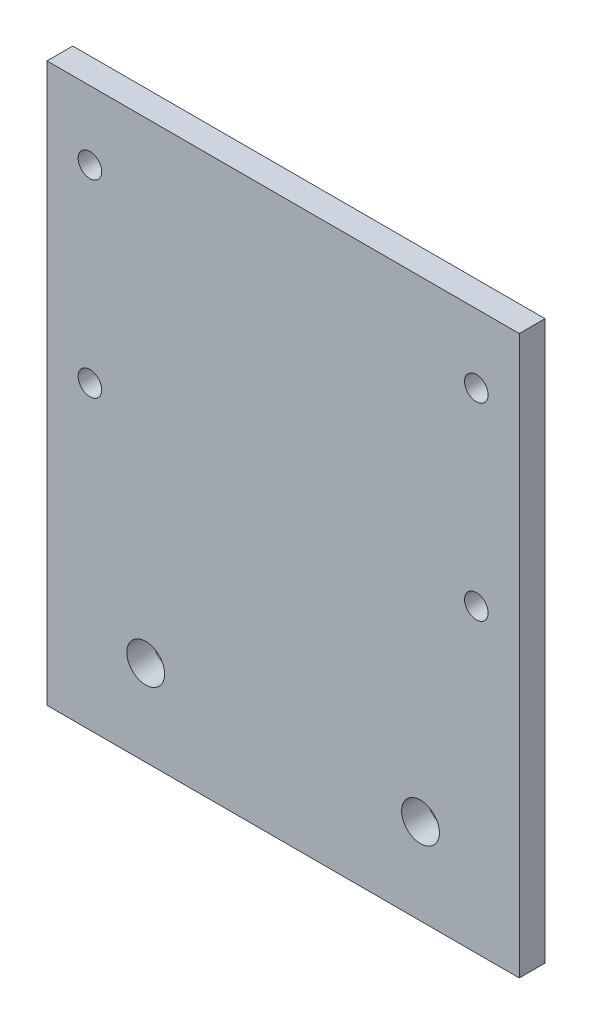
ISO-10303-21;
HEADER;
FILE_DESCRIPTION(('STEP AP214'),'2;1');
FILE_NAME('part.step','',(''),(''),'','','');
FILE_SCHEMA(('AUTOMOTIVE_DESIGN { 1 0 10303 214 1 1 1 1 }'));
ENDSEC;
DATA;
#1=APPLICATION_CONTEXT('core data for automotive mechanical design processes');
#2=APPLICATION_PROTOCOL_DEFINITION('international standard','automotive_design',2000,#1);
#3=PRODUCT_CONTEXT('',#1,'mechanical');
#4=PRODUCT('Part','Part','',(#3));
#5=PRODUCT_RELATED_PRODUCT_CATEGORY('part','',(#4));
#6=PRODUCT_DEFINITION_FORMATION('','',#4);
#7=PRODUCT_DEFINITION_CONTEXT('part definition',#1,'design');
#8=PRODUCT_DEFINITION('design','',#6,#7);
#9=PRODUCT_DEFINITION_SHAPE('','',#8);
#10=(LENGTH_UNIT() NAMED_UNIT(*) SI_UNIT(.MILLI.,.METRE.));
#11=(NAMED_UNIT(*) PLANE_ANGLE_UNIT() SI_UNIT($,.RADIAN.));
#12=(NAMED_UNIT(*) SI_UNIT($,.STERADIAN.) SOLID_ANGLE_UNIT());
#13=UNCERTAINTY_MEASURE_WITH_UNIT(LENGTH_MEASURE(1.E-05),#10,'distance_accuracy_value','');
#14=(GEOMETRIC_REPRESENTATION_CONTEXT(3) GLOBAL_UNCERTAINTY_ASSIGNED_CONTEXT((#13)) GLOBAL_UNIT_ASSIGNED_CONTEXT((#10,
#11,#12)) REPRESENTATION_CONTEXT('',''));
#15=CARTESIAN_POINT('',(0.,0.,0.));
#16=DIRECTION('',(0.,0.,1.));
#17=DIRECTION('',(1.,0.,0.));
#18=AXIS2_PLACEMENT_3D('',#15,#16,#17);
#19=CARTESIAN_POINT('',(0.,0.,3.));
#20=DIRECTION('',(0.,0.,-1.));
#21=DIRECTION('',(-1.,0.,0.));
#22=AXIS2_PLACEMENT_3D('',#19,#20,#21);
#23=PLANE('',#22);
#24=DIRECTION('',(0.,-1.,0.));
#25=VECTOR('',#24,1.);
#26=CARTESIAN_POINT('',(0.,0.,3.));
#27=LINE('',#26,#25);
#28=CARTESIAN_POINT('',(0.,65.,3.));
#29=VERTEX_POINT('',#28);
#30=CARTESIAN_POINT('',(0.,0.,3.));
#31=VERTEX_POINT('',#30);
#32=EDGE_CURVE('E92',#29,#31,#27,.T.);
#33=ORIENTED_EDGE('',*,*,#32,.T.);
#34=DIRECTION('',(1.,0.,0.));
#35=VECTOR('',#34,1.);
#36=CARTESIAN_POINT('',(0.,0.,3.));
#37=LINE('',#36,#35);
#38=CARTESIAN_POINT('',(55.,0.,3.));
#39=VERTEX_POINT('',#38);
#40=EDGE_CURVE('E87',#31,#39,#37,.T.);
#41=ORIENTED_EDGE('',*,*,#40,.T.);
#42=DIRECTION('',(0.,1.,0.));
#43=VECTOR('',#42,1.);
#44=CARTESIAN_POINT('',(55.,0.,3.));
#45=LINE('',#44,#43);
#46=CARTESIAN_POINT('',(55.,65.,3.));
#47=VERTEX_POINT('',#46);
#48=EDGE_CURVE('E90',#39,#47,#45,.T.);
#49=ORIENTED_EDGE('',*,*,#48,.T.);
#50=DIRECTION('',(-1.,0.,0.));
#51=VECTOR('',#50,1.);
#52=CARTESIAN_POINT('',(0.,65.,3.));
#53=LINE('',#52,#51);
#54=EDGE_CURVE('E57',#47,#29,#53,.T.);
#55=ORIENTED_EDGE('',*,*,#54,.T.);
#56=EDGE_LOOP('',(#33,#41,#49,#55));
#57=FACE_BOUND('',#56,.T.);
#58=CARTESIAN_POINT('',(5.,57.,3.));
#59=DIRECTION('',(0.,0.,1.));
#60=DIRECTION('',(1.,0.,0.));
#61=AXIS2_PLACEMENT_3D('',#58,#59,#60);
#62=CIRCLE('',#61,1.375);
#63=CARTESIAN_POINT('',(6.375,57.,3.));
#64=VERTEX_POINT('',#63);
#65=EDGE_CURVE('E112',#64,#64,#62,.T.);
#66=ORIENTED_EDGE('',*,*,#65,.F.);
#67=EDGE_LOOP('',(#66));
#68=FACE_BOUND('',#67,.T.);
#69=CARTESIAN_POINT('',(11.5,9.99999999999999,3.));
#70=DIRECTION('',(0.,0.,1.));
#71=DIRECTION('',(1.,0.,0.));
#72=AXIS2_PLACEMENT_3D('',#69,#70,#71);
#73=CIRCLE('',#72,2.2);
#74=CARTESIAN_POINT('',(13.7,9.99999999999999,3.));
#75=VERTEX_POINT('',#74);
#76=EDGE_CURVE('E134',#75,#75,#73,.T.);
#77=ORIENTED_EDGE('',*,*,#76,.F.);
#78=EDGE_LOOP('',(#77));
#79=FACE_BOUND('',#78,.T.);
#80=CARTESIAN_POINT('',(50.,57.,3.));
#81=DIRECTION('',(0.,0.,1.));
#82=DIRECTION('',(1.,0.,0.));
#83=AXIS2_PLACEMENT_3D('',#80,#81,#82);
#84=CIRCLE('',#83,1.375);
#85=CARTESIAN_POINT('',(51.375,57.,3.));
#86=VERTEX_POINT('',#85);
#87=EDGE_CURVE('E142',#86,#86,#84,.T.);
#88=ORIENTED_EDGE('',*,*,#87,.F.);
#89=EDGE_LOOP('',(#88));
#90=FACE_BOUND('',#89,.T.);
#91=CARTESIAN_POINT('',(50.0000000000002,35.,3.));
#92=DIRECTION('',(0.,0.,1.));
#93=DIRECTION('',(1.,0.,0.));
#94=AXIS2_PLACEMENT_3D('',#91,#92,#93);
#95=CIRCLE('',#94,1.375);
#96=CARTESIAN_POINT('',(51.3750000000002,35.,3.));
#97=VERTEX_POINT('',#96);
#98=EDGE_CURVE('E150',#97,#97,#95,.T.);
#99=ORIENTED_EDGE('',*,*,#98,.F.);
#100=EDGE_LOOP('',(#99));
#101=FACE_BOUND('',#100,.T.);
#102=CARTESIAN_POINT('',(5.00000000000023,35.,3.));
#103=DIRECTION('',(0.,0.,1.));
#104=DIRECTION('',(1.,0.,0.));
#105=AXIS2_PLACEMENT_3D('',#102,#103,#104);
#106=CIRCLE('',#105,1.375);
#107=CARTESIAN_POINT('',(6.37500000000023,35.,3.));
#108=VERTEX_POINT('',#107);
#109=EDGE_CURVE('E158',#108,#108,#106,.T.);
#110=ORIENTED_EDGE('',*,*,#109,.F.);
#111=EDGE_LOOP('',(#110));
#112=FACE_BOUND('',#111,.T.);
#113=CARTESIAN_POINT('',(43.5,10.,3.));
#114=DIRECTION('',(0.,0.,1.));
#115=DIRECTION('',(1.,0.,0.));
#116=AXIS2_PLACEMENT_3D('',#113,#114,#115);
#117=CIRCLE('',#116,2.2);
#118=CARTESIAN_POINT('',(45.7,10.,3.));
#119=VERTEX_POINT('',#118);
#120=EDGE_CURVE('E166',#119,#119,#117,.T.);
#121=ORIENTED_EDGE('',*,*,#120,.F.);
#122=EDGE_LOOP('',(#121));
#123=FACE_BOUND('',#122,.T.);
#124=ADVANCED_FACE('F39',(#57,#68,#79,#90,#101,#112,#123),#23,.F.);
#125=CARTESIAN_POINT('',(0.,0.,0.));
#126=DIRECTION('',(0.,0.,-1.));
#127=DIRECTION('',(-1.,0.,0.));
#128=AXIS2_PLACEMENT_3D('',#125,#126,#127);
#129=PLANE('',#128);
#130=CARTESIAN_POINT('',(5.00000000000023,35.,0.));
#131=DIRECTION('',(0.,0.,1.));
#132=DIRECTION('',(1.,0.,0.));
#133=AXIS2_PLACEMENT_3D('',#130,#131,#132);
#134=CIRCLE('',#133,1.375);
#135=CARTESIAN_POINT('',(6.37500000000023,35.,0.));
#136=VERTEX_POINT('',#135);
#137=EDGE_CURVE('E162',#136,#136,#134,.T.);
#138=ORIENTED_EDGE('',*,*,#137,.T.);
#139=EDGE_LOOP('',(#138));
#140=FACE_BOUND('',#139,.T.);
#141=CARTESIAN_POINT('',(50.,57.,0.));
#142=DIRECTION('',(0.,0.,1.));
#143=DIRECTION('',(1.,0.,0.));
#144=AXIS2_PLACEMENT_3D('',#141,#142,#143);
#145=CIRCLE('',#144,1.375);
#146=CARTESIAN_POINT('',(51.375,57.,0.));
#147=VERTEX_POINT('',#146);
#148=EDGE_CURVE('E146',#147,#147,#145,.T.);
#149=ORIENTED_EDGE('',*,*,#148,.T.);
#150=EDGE_LOOP('',(#149));
#151=FACE_BOUND('',#150,.T.);
#152=CARTESIAN_POINT('',(5.,57.,0.));
#153=DIRECTION('',(0.,0.,1.));
#154=DIRECTION('',(1.,0.,0.));
#155=AXIS2_PLACEMENT_3D('',#152,#153,#154);
#156=CIRCLE('',#155,1.375);
#157=CARTESIAN_POINT('',(6.375,57.,0.));
#158=VERTEX_POINT('',#157);
#159=EDGE_CURVE('E130',#158,#158,#156,.T.);
#160=ORIENTED_EDGE('',*,*,#159,.T.);
#161=EDGE_LOOP('',(#160));
#162=FACE_BOUND('',#161,.T.);
#163=DIRECTION('',(0.,-1.,0.));
#164=VECTOR('',#163,1.);
#165=CARTESIAN_POINT('',(0.,0.,0.));
#166=LINE('',#165,#164);
#167=CARTESIAN_POINT('',(0.,65.,0.));
#168=VERTEX_POINT('',#167);
#169=CARTESIAN_POINT('',(0.,0.,0.));
#170=VERTEX_POINT('',#169);
#171=EDGE_CURVE('E108',#168,#170,#166,.T.);
#172=ORIENTED_EDGE('',*,*,#171,.F.);
#173=DIRECTION('',(-1.,0.,0.));
#174=VECTOR('',#173,1.);
#175=CARTESIAN_POINT('',(0.,65.,0.));
#176=LINE('',#175,#174);
#177=CARTESIAN_POINT('',(55.,65.,0.));
#178=VERTEX_POINT('',#177);
#179=EDGE_CURVE('E80',#178,#168,#176,.T.);
#180=ORIENTED_EDGE('',*,*,#179,.F.);
#181=DIRECTION('',(0.,1.,0.));
#182=VECTOR('',#181,1.);
#183=CARTESIAN_POINT('',(55.,0.,0.));
#184=LINE('',#183,#182);
#185=CARTESIAN_POINT('',(55.,0.,0.));
#186=VERTEX_POINT('',#185);
#187=EDGE_CURVE('E74',#186,#178,#184,.T.);
#188=ORIENTED_EDGE('',*,*,#187,.F.);
#189=DIRECTION('',(1.,0.,0.));
#190=VECTOR('',#189,1.);
#191=CARTESIAN_POINT('',(0.,0.,0.));
#192=LINE('',#191,#190);
#193=EDGE_CURVE('E97',#170,#186,#192,.T.);
#194=ORIENTED_EDGE('',*,*,#193,.F.);
#195=EDGE_LOOP('',(#172,#180,#188,#194));
#196=FACE_BOUND('',#195,.T.);
#197=CARTESIAN_POINT('',(11.5,9.99999999999999,0.));
#198=DIRECTION('',(0.,0.,1.));
#199=DIRECTION('',(1.,0.,0.));
#200=AXIS2_PLACEMENT_3D('',#197,#198,#199);
#201=CIRCLE('',#200,2.2);
#202=CARTESIAN_POINT('',(13.7,9.99999999999999,0.));
#203=VERTEX_POINT('',#202);
#204=EDGE_CURVE('E138',#203,#203,#201,.T.);
#205=ORIENTED_EDGE('',*,*,#204,.T.);
#206=EDGE_LOOP('',(#205));
#207=FACE_BOUND('',#206,.T.);
#208=CARTESIAN_POINT('',(50.0000000000002,35.,0.));
#209=DIRECTION('',(0.,0.,1.));
#210=DIRECTION('',(1.,0.,0.));
#211=AXIS2_PLACEMENT_3D('',#208,#209,#210);
#212=CIRCLE('',#211,1.375);
#213=CARTESIAN_POINT('',(51.3750000000002,35.,0.));
#214=VERTEX_POINT('',#213);
#215=EDGE_CURVE('E154',#214,#214,#212,.T.);
#216=ORIENTED_EDGE('',*,*,#215,.T.);
#217=EDGE_LOOP('',(#216));
#218=FACE_BOUND('',#217,.T.);
#219=CARTESIAN_POINT('',(43.5,10.,0.));
#220=DIRECTION('',(0.,0.,1.));
#221=DIRECTION('',(1.,0.,0.));
#222=AXIS2_PLACEMENT_3D('',#219,#220,#221);
#223=CIRCLE('',#222,2.2);
#224=CARTESIAN_POINT('',(45.7,10.,0.));
#225=VERTEX_POINT('',#224);
#226=EDGE_CURVE('E170',#225,#225,#223,.T.);
#227=ORIENTED_EDGE('',*,*,#226,.T.);
#228=EDGE_LOOP('',(#227));
#229=FACE_BOUND('',#228,.T.);
#230=ADVANCED_FACE('F125',(#140,#151,#162,#196,#207,#218,#229),#129,.T.);
#231=CARTESIAN_POINT('',(0.,0.,3.));
#232=DIRECTION('',(1.,0.,0.));
#233=DIRECTION('',(0.,0.,-1.));
#234=AXIS2_PLACEMENT_3D('',#231,#232,#233);
#235=PLANE('',#234);
#236=ORIENTED_EDGE('',*,*,#171,.T.);
#237=DIRECTION('',(0.,0.,-1.));
#238=VECTOR('',#237,1.);
#239=CARTESIAN_POINT('',(0.,0.,3.));
#240=LINE('',#239,#238);
#241=EDGE_CURVE('E11',#31,#170,#240,.T.);
#242=ORIENTED_EDGE('',*,*,#241,.F.);
#243=ORIENTED_EDGE('',*,*,#32,.F.);
#244=DIRECTION('',(0.,0.,-1.));
#245=VECTOR('',#244,1.);
#246=CARTESIAN_POINT('',(0.,65.,3.));
#247=LINE('',#246,#245);
#248=EDGE_CURVE('E104',#29,#168,#247,.T.);
#249=ORIENTED_EDGE('',*,*,#248,.T.);
#250=EDGE_LOOP('',(#236,#242,#243,#249));
#251=FACE_BOUND('',#250,.T.);
#252=ADVANCED_FACE('F41',(#251),#235,.F.);
#253=CARTESIAN_POINT('',(0.,0.,3.));
#254=DIRECTION('',(0.,1.,0.));
#255=DIRECTION('',(-1.,0.,0.));
#256=AXIS2_PLACEMENT_3D('',#253,#254,#255);
#257=PLANE('',#256);
#258=ORIENTED_EDGE('',*,*,#193,.T.);
#259=DIRECTION('',(0.,0.,-1.));
#260=VECTOR('',#259,1.);
#261=CARTESIAN_POINT('',(55.,0.,3.));
#262=LINE('',#261,#260);
#263=EDGE_CURVE('E49',#39,#186,#262,.T.);
#264=ORIENTED_EDGE('',*,*,#263,.F.);
#265=ORIENTED_EDGE('',*,*,#40,.F.);
#266=ORIENTED_EDGE('',*,*,#241,.T.);
#267=EDGE_LOOP('',(#258,#264,#265,#266));
#268=FACE_BOUND('',#267,.T.);
#269=ADVANCED_FACE('F96',(#268),#257,.F.);
#270=CARTESIAN_POINT('',(55.,0.,3.));
#271=DIRECTION('',(-1.,0.,0.));
#272=DIRECTION('',(0.,-1.,0.));
#273=AXIS2_PLACEMENT_3D('',#270,#271,#272);
#274=PLANE('',#273);
#275=ORIENTED_EDGE('',*,*,#187,.T.);
#276=DIRECTION('',(0.,0.,-1.));
#277=VECTOR('',#276,1.);
#278=CARTESIAN_POINT('',(55.,65.,3.));
#279=LINE('',#278,#277);
#280=EDGE_CURVE('E99',#47,#178,#279,.T.);
#281=ORIENTED_EDGE('',*,*,#280,.F.);
#282=ORIENTED_EDGE('',*,*,#48,.F.);
#283=ORIENTED_EDGE('',*,*,#263,.T.);
#284=EDGE_LOOP('',(#275,#281,#282,#283));
#285=FACE_BOUND('',#284,.T.);
#286=ADVANCED_FACE('F100',(#285),#274,.F.);
#287=CARTESIAN_POINT('',(0.,65.,3.));
#288=DIRECTION('',(0.,-1.,0.));
#289=DIRECTION('',(0.,0.,-1.));
#290=AXIS2_PLACEMENT_3D('',#287,#288,#289);
#291=PLANE('',#290);
#292=ORIENTED_EDGE('',*,*,#179,.T.);
#293=ORIENTED_EDGE('',*,*,#248,.F.);
#294=ORIENTED_EDGE('',*,*,#54,.F.);
#295=ORIENTED_EDGE('',*,*,#280,.T.);
#296=EDGE_LOOP('',(#292,#293,#294,#295));
#297=FACE_BOUND('',#296,.T.);
#298=ADVANCED_FACE('F122',(#297),#291,.F.);
#299=CARTESIAN_POINT('',(5.,57.,3.));
#300=DIRECTION('',(0.,0.,-1.));
#301=DIRECTION('',(-1.,0.,0.));
#302=AXIS2_PLACEMENT_3D('',#299,#300,#301);
#303=CYLINDRICAL_SURFACE('',#302,1.375);
#304=ORIENTED_EDGE('',*,*,#65,.T.);
#305=EDGE_LOOP('',(#304));
#306=FACE_BOUND('',#305,.T.);
#307=ORIENTED_EDGE('',*,*,#159,.F.);
#308=EDGE_LOOP('',(#307));
#309=FACE_BOUND('',#308,.T.);
#310=ADVANCED_FACE('F189',(#306,#309),#303,.F.);
#311=CARTESIAN_POINT('',(11.5,9.99999999999999,3.));
#312=DIRECTION('',(0.,0.,-1.));
#313=DIRECTION('',(-1.,0.,0.));
#314=AXIS2_PLACEMENT_3D('',#311,#312,#313);
#315=CYLINDRICAL_SURFACE('',#314,2.2);
#316=ORIENTED_EDGE('',*,*,#76,.T.);
#317=EDGE_LOOP('',(#316));
#318=FACE_BOUND('',#317,.T.);
#319=ORIENTED_EDGE('',*,*,#204,.F.);
#320=EDGE_LOOP('',(#319));
#321=FACE_BOUND('',#320,.T.);
#322=ADVANCED_FACE('F235',(#318,#321),#315,.F.);
#323=CARTESIAN_POINT('',(50.,57.,3.));
#324=DIRECTION('',(0.,0.,-1.));
#325=DIRECTION('',(-1.,0.,0.));
#326=AXIS2_PLACEMENT_3D('',#323,#324,#325);
#327=CYLINDRICAL_SURFACE('',#326,1.375);
#328=ORIENTED_EDGE('',*,*,#87,.T.);
#329=EDGE_LOOP('',(#328));
#330=FACE_BOUND('',#329,.T.);
#331=ORIENTED_EDGE('',*,*,#148,.F.);
#332=EDGE_LOOP('',(#331));
#333=FACE_BOUND('',#332,.T.);
#334=ADVANCED_FACE('F243',(#330,#333),#327,.F.);
#335=CARTESIAN_POINT('',(50.0000000000002,35.,3.));
#336=DIRECTION('',(0.,0.,-1.));
#337=DIRECTION('',(-1.,0.,0.));
#338=AXIS2_PLACEMENT_3D('',#335,#336,#337);
#339=CYLINDRICAL_SURFACE('',#338,1.375);
#340=ORIENTED_EDGE('',*,*,#98,.T.);
#341=EDGE_LOOP('',(#340));
#342=FACE_BOUND('',#341,.T.);
#343=ORIENTED_EDGE('',*,*,#215,.F.);
#344=EDGE_LOOP('',(#343));
#345=FACE_BOUND('',#344,.T.);
#346=ADVANCED_FACE('F251',(#342,#345),#339,.F.);
#347=CARTESIAN_POINT('',(5.00000000000023,35.,3.));
#348=DIRECTION('',(0.,0.,-1.));
#349=DIRECTION('',(-1.,0.,0.));
#350=AXIS2_PLACEMENT_3D('',#347,#348,#349);
#351=CYLINDRICAL_SURFACE('',#350,1.375);
#352=ORIENTED_EDGE('',*,*,#109,.T.);
#353=EDGE_LOOP('',(#352));
#354=FACE_BOUND('',#353,.T.);
#355=ORIENTED_EDGE('',*,*,#137,.F.);
#356=EDGE_LOOP('',(#355));
#357=FACE_BOUND('',#356,.T.);
#358=ADVANCED_FACE('F260',(#354,#357),#351,.F.);
#359=CARTESIAN_POINT('',(43.5,10.,3.));
#360=DIRECTION('',(0.,0.,-1.));
#361=DIRECTION('',(-1.,0.,0.));
#362=AXIS2_PLACEMENT_3D('',#359,#360,#361);
#363=CYLINDRICAL_SURFACE('',#362,2.2);
#364=ORIENTED_EDGE('',*,*,#120,.T.);
#365=EDGE_LOOP('',(#364));
#366=FACE_BOUND('',#365,.T.);
#367=ORIENTED_EDGE('',*,*,#226,.F.);
#368=EDGE_LOOP('',(#367));
#369=FACE_BOUND('',#368,.T.);
#370=ADVANCED_FACE('F178',(#366,#369),#363,.F.);
#371=CLOSED_SHELL('',(#124,#230,#252,#269,#286,#298,#310,#322,#334,#346,#358,#370));
#372=MANIFOLD_SOLID_BREP('B2',#371);
#373=ADVANCED_BREP_SHAPE_REPRESENTATION('',(#18,#372),#14);
#374=SHAPE_DEFINITION_REPRESENTATION(#9,#373);
ENDSEC;
END-ISO-10303-21;
